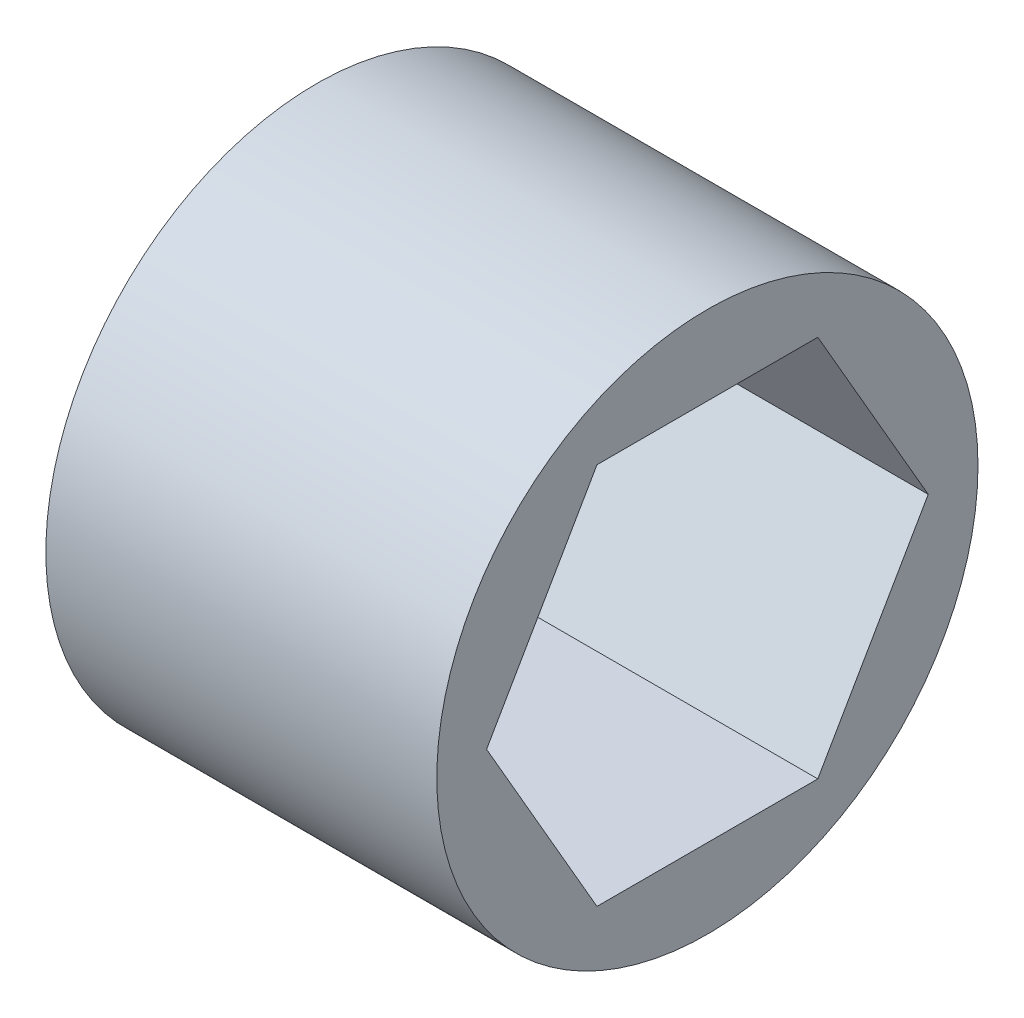
ISO-10303-21;
HEADER;
FILE_DESCRIPTION(('STEP AP214'),'2;1');
FILE_NAME('part.step','',(''),(''),'','','');
FILE_SCHEMA(('AUTOMOTIVE_DESIGN { 1 0 10303 214 1 1 1 1 }'));
ENDSEC;
DATA;
#1=APPLICATION_CONTEXT('core data for automotive mechanical design processes');
#2=APPLICATION_PROTOCOL_DEFINITION('international standard','automotive_design',2000,#1);
#3=PRODUCT_CONTEXT('',#1,'mechanical');
#4=PRODUCT('Part','Part','',(#3));
#5=PRODUCT_RELATED_PRODUCT_CATEGORY('part','',(#4));
#6=PRODUCT_DEFINITION_FORMATION('','',#4);
#7=PRODUCT_DEFINITION_CONTEXT('part definition',#1,'design');
#8=PRODUCT_DEFINITION('design','',#6,#7);
#9=PRODUCT_DEFINITION_SHAPE('','',#8);
#10=(LENGTH_UNIT() NAMED_UNIT(*) SI_UNIT(.MILLI.,.METRE.));
#11=(NAMED_UNIT(*) PLANE_ANGLE_UNIT() SI_UNIT($,.RADIAN.));
#12=(NAMED_UNIT(*) SI_UNIT($,.STERADIAN.) SOLID_ANGLE_UNIT());
#13=UNCERTAINTY_MEASURE_WITH_UNIT(LENGTH_MEASURE(1.E-05),#10,'distance_accuracy_value','');
#14=(GEOMETRIC_REPRESENTATION_CONTEXT(3) GLOBAL_UNCERTAINTY_ASSIGNED_CONTEXT((#13)) GLOBAL_UNIT_ASSIGNED_CONTEXT((#10,
#11,#12)) REPRESENTATION_CONTEXT('',''));
#15=CARTESIAN_POINT('',(0.,0.,0.));
#16=DIRECTION('',(0.,0.,1.));
#17=DIRECTION('',(1.,0.,0.));
#18=AXIS2_PLACEMENT_3D('',#15,#16,#17);
#19=CARTESIAN_POINT('',(13.76045,0.,0.));
#20=DIRECTION('',(1.,0.,0.));
#21=DIRECTION('',(0.,0.,-1.));
#22=AXIS2_PLACEMENT_3D('',#19,#20,#21);
#23=PLANE('',#22);
#24=CARTESIAN_POINT('',(13.76045,0.,0.));
#25=DIRECTION('',(1.,0.,0.));
#26=DIRECTION('',(0.,0.,-1.));
#27=AXIS2_PLACEMENT_3D('',#24,#25,#26);
#28=CIRCLE('',#27,9.525);
#29=CARTESIAN_POINT('',(13.76045,0.,-9.525));
#30=VERTEX_POINT('',#29);
#31=EDGE_CURVE('E11',#30,#30,#28,.T.);
#32=ORIENTED_EDGE('',*,*,#31,.T.);
#33=EDGE_LOOP('',(#32));
#34=FACE_BOUND('',#33,.T.);
#35=DIRECTION('',(0.,0.866025403784439,0.5));
#36=VECTOR('',#35,1.);
#37=CARTESIAN_POINT('',(13.76045,0.,-7.77228932383074));
#38=LINE('',#37,#36);
#39=CARTESIAN_POINT('',(13.76045,0.,-7.77228932383074));
#40=VERTEX_POINT('',#39);
#41=CARTESIAN_POINT('',(13.76045,6.731,-3.88614466191537));
#42=VERTEX_POINT('',#41);
#43=EDGE_CURVE('E94',#40,#42,#38,.T.);
#44=ORIENTED_EDGE('',*,*,#43,.F.);
#45=DIRECTION('',(0.,0.866025403784439,-0.5));
#46=VECTOR('',#45,1.);
#47=CARTESIAN_POINT('',(13.76045,-6.731,-3.88614466191537));
#48=LINE('',#47,#46);
#49=CARTESIAN_POINT('',(13.76045,-6.731,-3.88614466191537));
#50=VERTEX_POINT('',#49);
#51=EDGE_CURVE('E86',#50,#40,#48,.T.);
#52=ORIENTED_EDGE('',*,*,#51,.F.);
#53=DIRECTION('',(0.,0.,-1.));
#54=VECTOR('',#53,1.);
#55=CARTESIAN_POINT('',(13.76045,-6.731,3.88614466191537));
#56=LINE('',#55,#54);
#57=CARTESIAN_POINT('',(13.76045,-6.731,3.88614466191537));
#58=VERTEX_POINT('',#57);
#59=EDGE_CURVE('E114',#58,#50,#56,.T.);
#60=ORIENTED_EDGE('',*,*,#59,.F.);
#61=DIRECTION('',(0.,-0.866025403784439,-0.5));
#62=VECTOR('',#61,1.);
#63=CARTESIAN_POINT('',(13.76045,0.,7.77228932383074));
#64=LINE('',#63,#62);
#65=CARTESIAN_POINT('',(13.76045,0.,7.77228932383074));
#66=VERTEX_POINT('',#65);
#67=EDGE_CURVE('E112',#66,#58,#64,.T.);
#68=ORIENTED_EDGE('',*,*,#67,.F.);
#69=DIRECTION('',(0.,-0.866025403784439,0.5));
#70=VECTOR('',#69,1.);
#71=CARTESIAN_POINT('',(13.76045,6.731,3.88614466191537));
#72=LINE('',#71,#70);
#73=CARTESIAN_POINT('',(13.76045,6.731,3.88614466191537));
#74=VERTEX_POINT('',#73);
#75=EDGE_CURVE('E108',#74,#66,#72,.T.);
#76=ORIENTED_EDGE('',*,*,#75,.F.);
#77=DIRECTION('',(0.,0.,1.));
#78=VECTOR('',#77,1.);
#79=CARTESIAN_POINT('',(13.76045,6.731,-3.88614466191537));
#80=LINE('',#79,#78);
#81=EDGE_CURVE('E106',#42,#74,#80,.T.);
#82=ORIENTED_EDGE('',*,*,#81,.F.);
#83=EDGE_LOOP('',(#44,#52,#60,#68,#76,#82));
#84=FACE_BOUND('',#83,.T.);
#85=ADVANCED_FACE('F33',(#34,#84),#23,.T.);
#86=CARTESIAN_POINT('',(0.,0.,0.));
#87=DIRECTION('',(1.,0.,0.));
#88=DIRECTION('',(0.,0.,-1.));
#89=AXIS2_PLACEMENT_3D('',#86,#87,#88);
#90=PLANE('',#89);
#91=CARTESIAN_POINT('',(0.,0.,0.));
#92=DIRECTION('',(1.,0.,0.));
#93=DIRECTION('',(0.,0.,-1.));
#94=AXIS2_PLACEMENT_3D('',#91,#92,#93);
#95=CIRCLE('',#94,9.525);
#96=CARTESIAN_POINT('',(0.,0.,-9.525));
#97=VERTEX_POINT('',#96);
#98=EDGE_CURVE('E37',#97,#97,#95,.T.);
#99=ORIENTED_EDGE('',*,*,#98,.F.);
#100=EDGE_LOOP('',(#99));
#101=FACE_BOUND('',#100,.T.);
#102=DIRECTION('',(0.,0.866025403784439,-0.5));
#103=VECTOR('',#102,1.);
#104=CARTESIAN_POINT('',(0.,-6.731,-3.88614466191537));
#105=LINE('',#104,#103);
#106=CARTESIAN_POINT('',(0.,-6.731,-3.88614466191537));
#107=VERTEX_POINT('',#106);
#108=CARTESIAN_POINT('',(0.,0.,-7.77228932383074));
#109=VERTEX_POINT('',#108);
#110=EDGE_CURVE('E56',#107,#109,#105,.T.);
#111=ORIENTED_EDGE('',*,*,#110,.T.);
#112=DIRECTION('',(0.,0.866025403784439,0.5));
#113=VECTOR('',#112,1.);
#114=CARTESIAN_POINT('',(0.,0.,-7.77228932383074));
#115=LINE('',#114,#113);
#116=CARTESIAN_POINT('',(0.,6.731,-3.88614466191537));
#117=VERTEX_POINT('',#116);
#118=EDGE_CURVE('E101',#109,#117,#115,.T.);
#119=ORIENTED_EDGE('',*,*,#118,.T.);
#120=DIRECTION('',(0.,0.,1.));
#121=VECTOR('',#120,1.);
#122=CARTESIAN_POINT('',(0.,6.731,-3.88614466191537));
#123=LINE('',#122,#121);
#124=CARTESIAN_POINT('',(0.,6.731,3.88614466191537));
#125=VERTEX_POINT('',#124);
#126=EDGE_CURVE('E118',#117,#125,#123,.T.);
#127=ORIENTED_EDGE('',*,*,#126,.T.);
#128=DIRECTION('',(0.,-0.866025403784439,0.5));
#129=VECTOR('',#128,1.);
#130=CARTESIAN_POINT('',(0.,6.731,3.88614466191537));
#131=LINE('',#130,#129);
#132=CARTESIAN_POINT('',(0.,0.,7.77228932383074));
#133=VERTEX_POINT('',#132);
#134=EDGE_CURVE('E121',#125,#133,#131,.T.);
#135=ORIENTED_EDGE('',*,*,#134,.T.);
#136=DIRECTION('',(0.,-0.866025403784439,-0.5));
#137=VECTOR('',#136,1.);
#138=CARTESIAN_POINT('',(0.,0.,7.77228932383074));
#139=LINE('',#138,#137);
#140=CARTESIAN_POINT('',(0.,-6.731,3.88614466191537));
#141=VERTEX_POINT('',#140);
#142=EDGE_CURVE('E124',#133,#141,#139,.T.);
#143=ORIENTED_EDGE('',*,*,#142,.T.);
#144=DIRECTION('',(0.,0.,-1.));
#145=VECTOR('',#144,1.);
#146=CARTESIAN_POINT('',(0.,-6.731,3.88614466191537));
#147=LINE('',#146,#145);
#148=EDGE_CURVE('E95',#141,#107,#147,.T.);
#149=ORIENTED_EDGE('',*,*,#148,.T.);
#150=EDGE_LOOP('',(#111,#119,#127,#135,#143,#149));
#151=FACE_BOUND('',#150,.T.);
#152=ADVANCED_FACE('F141',(#101,#151),#90,.F.);
#153=CARTESIAN_POINT('',(13.76045,0.,0.));
#154=DIRECTION('',(-1.,0.,0.));
#155=DIRECTION('',(0.,0.,1.));
#156=AXIS2_PLACEMENT_3D('',#153,#154,#155);
#157=CYLINDRICAL_SURFACE('',#156,9.525);
#158=ORIENTED_EDGE('',*,*,#31,.F.);
#159=EDGE_LOOP('',(#158));
#160=FACE_BOUND('',#159,.T.);
#161=ORIENTED_EDGE('',*,*,#98,.T.);
#162=EDGE_LOOP('',(#161));
#163=FACE_BOUND('',#162,.T.);
#164=ADVANCED_FACE('F35',(#160,#163),#157,.T.);
#165=CARTESIAN_POINT('',(13.76045,-6.731,-3.88614466191537));
#166=DIRECTION('',(0.,0.5,0.866025403784439));
#167=DIRECTION('',(0.,-0.866025403784439,0.5));
#168=AXIS2_PLACEMENT_3D('',#165,#166,#167);
#169=PLANE('',#168);
#170=ORIENTED_EDGE('',*,*,#110,.F.);
#171=DIRECTION('',(-1.,0.,0.));
#172=VECTOR('',#171,1.);
#173=CARTESIAN_POINT('',(13.76045,-6.731,-3.88614466191537));
#174=LINE('',#173,#172);
#175=EDGE_CURVE('E90',#50,#107,#174,.T.);
#176=ORIENTED_EDGE('',*,*,#175,.F.);
#177=ORIENTED_EDGE('',*,*,#51,.T.);
#178=DIRECTION('',(-1.,0.,0.));
#179=VECTOR('',#178,1.);
#180=CARTESIAN_POINT('',(13.76045,0.,-7.77228932383074));
#181=LINE('',#180,#179);
#182=EDGE_CURVE('E89',#40,#109,#181,.T.);
#183=ORIENTED_EDGE('',*,*,#182,.T.);
#184=EDGE_LOOP('',(#170,#176,#177,#183));
#185=FACE_BOUND('',#184,.T.);
#186=ADVANCED_FACE('F88',(#185),#169,.T.);
#187=CARTESIAN_POINT('',(13.76045,0.,-7.77228932383074));
#188=DIRECTION('',(0.,-0.5,0.866025403784439));
#189=DIRECTION('',(0.,-0.866025403784439,-0.5));
#190=AXIS2_PLACEMENT_3D('',#187,#188,#189);
#191=PLANE('',#190);
#192=ORIENTED_EDGE('',*,*,#118,.F.);
#193=ORIENTED_EDGE('',*,*,#182,.F.);
#194=ORIENTED_EDGE('',*,*,#43,.T.);
#195=DIRECTION('',(-1.,0.,0.));
#196=VECTOR('',#195,1.);
#197=CARTESIAN_POINT('',(13.76045,6.731,-3.88614466191537));
#198=LINE('',#197,#196);
#199=EDGE_CURVE('E102',#42,#117,#198,.T.);
#200=ORIENTED_EDGE('',*,*,#199,.T.);
#201=EDGE_LOOP('',(#192,#193,#194,#200));
#202=FACE_BOUND('',#201,.T.);
#203=ADVANCED_FACE('F98',(#202),#191,.T.);
#204=CARTESIAN_POINT('',(13.76045,6.731,-3.88614466191537));
#205=DIRECTION('',(0.,-1.,0.));
#206=DIRECTION('',(0.,0.,-1.));
#207=AXIS2_PLACEMENT_3D('',#204,#205,#206);
#208=PLANE('',#207);
#209=ORIENTED_EDGE('',*,*,#126,.F.);
#210=ORIENTED_EDGE('',*,*,#199,.F.);
#211=ORIENTED_EDGE('',*,*,#81,.T.);
#212=DIRECTION('',(-1.,0.,0.));
#213=VECTOR('',#212,1.);
#214=CARTESIAN_POINT('',(13.76045,6.731,3.88614466191537));
#215=LINE('',#214,#213);
#216=EDGE_CURVE('E133',#74,#125,#215,.T.);
#217=ORIENTED_EDGE('',*,*,#216,.T.);
#218=EDGE_LOOP('',(#209,#210,#211,#217));
#219=FACE_BOUND('',#218,.T.);
#220=ADVANCED_FACE('F137',(#219),#208,.T.);
#221=CARTESIAN_POINT('',(13.76045,6.731,3.88614466191537));
#222=DIRECTION('',(0.,-0.5,-0.866025403784439));
#223=DIRECTION('',(0.,0.866025403784439,-0.5));
#224=AXIS2_PLACEMENT_3D('',#221,#222,#223);
#225=PLANE('',#224);
#226=ORIENTED_EDGE('',*,*,#134,.F.);
#227=ORIENTED_EDGE('',*,*,#216,.F.);
#228=ORIENTED_EDGE('',*,*,#75,.T.);
#229=DIRECTION('',(-1.,0.,0.));
#230=VECTOR('',#229,1.);
#231=CARTESIAN_POINT('',(13.76045,0.,7.77228932383074));
#232=LINE('',#231,#230);
#233=EDGE_CURVE('E131',#66,#133,#232,.T.);
#234=ORIENTED_EDGE('',*,*,#233,.T.);
#235=EDGE_LOOP('',(#226,#227,#228,#234));
#236=FACE_BOUND('',#235,.T.);
#237=ADVANCED_FACE('F149',(#236),#225,.T.);
#238=CARTESIAN_POINT('',(13.76045,0.,7.77228932383074));
#239=DIRECTION('',(0.,0.5,-0.866025403784439));
#240=DIRECTION('',(0.,0.866025403784439,0.5));
#241=AXIS2_PLACEMENT_3D('',#238,#239,#240);
#242=PLANE('',#241);
#243=ORIENTED_EDGE('',*,*,#142,.F.);
#244=ORIENTED_EDGE('',*,*,#233,.F.);
#245=ORIENTED_EDGE('',*,*,#67,.T.);
#246=DIRECTION('',(-1.,0.,0.));
#247=VECTOR('',#246,1.);
#248=CARTESIAN_POINT('',(13.76045,-6.731,3.88614466191537));
#249=LINE('',#248,#247);
#250=EDGE_CURVE('E48',#58,#141,#249,.T.);
#251=ORIENTED_EDGE('',*,*,#250,.T.);
#252=EDGE_LOOP('',(#243,#244,#245,#251));
#253=FACE_BOUND('',#252,.T.);
#254=ADVANCED_FACE('F147',(#253),#242,.T.);
#255=CARTESIAN_POINT('',(13.76045,-6.731,3.88614466191537));
#256=DIRECTION('',(0.,1.,0.));
#257=DIRECTION('',(0.,0.,1.));
#258=AXIS2_PLACEMENT_3D('',#255,#256,#257);
#259=PLANE('',#258);
#260=ORIENTED_EDGE('',*,*,#148,.F.);
#261=ORIENTED_EDGE('',*,*,#250,.F.);
#262=ORIENTED_EDGE('',*,*,#59,.T.);
#263=ORIENTED_EDGE('',*,*,#175,.T.);
#264=EDGE_LOOP('',(#260,#261,#262,#263));
#265=FACE_BOUND('',#264,.T.);
#266=ADVANCED_FACE('F143',(#265),#259,.T.);
#267=CLOSED_SHELL('',(#85,#152,#164,#186,#203,#220,#237,#254,#266));
#268=MANIFOLD_SOLID_BREP('B2',#267);
#269=ADVANCED_BREP_SHAPE_REPRESENTATION('',(#18,#268),#14);
#270=SHAPE_DEFINITION_REPRESENTATION(#9,#269);
ENDSEC;
END-ISO-10303-21;
